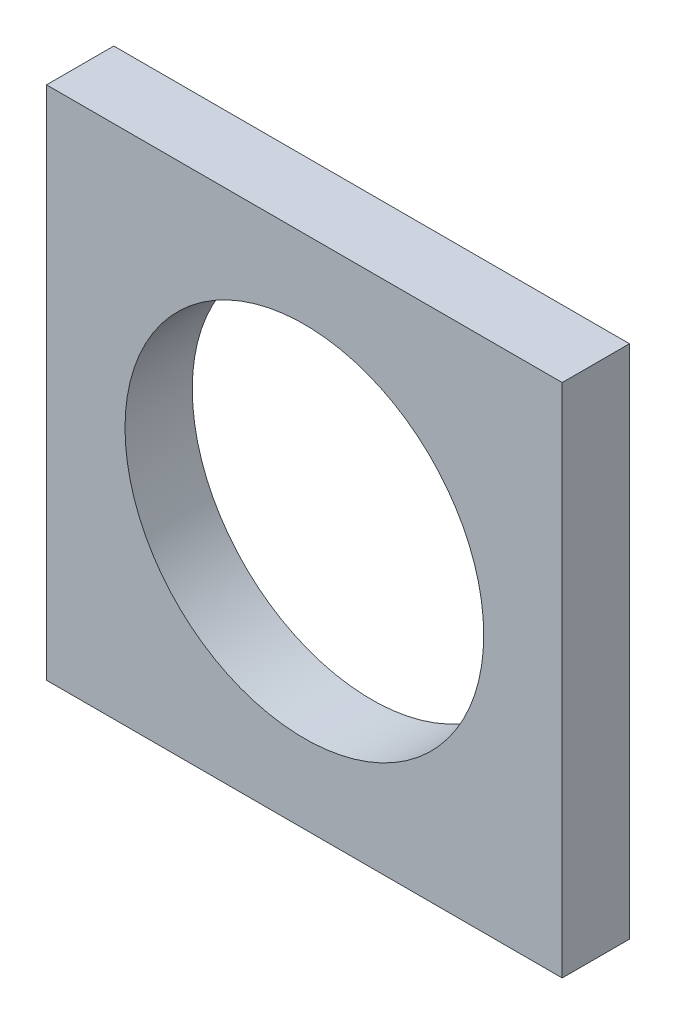
ISO-10303-21;
HEADER;
FILE_DESCRIPTION(('STEP AP214'),'2;1');
FILE_NAME('part.step','',(''),(''),'','','');
FILE_SCHEMA(('AUTOMOTIVE_DESIGN { 1 0 10303 214 1 1 1 1 }'));
ENDSEC;
DATA;
#1=APPLICATION_CONTEXT('core data for automotive mechanical design processes');
#2=APPLICATION_PROTOCOL_DEFINITION('international standard','automotive_design',2000,#1);
#3=PRODUCT_CONTEXT('',#1,'mechanical');
#4=PRODUCT('Part','Part','',(#3));
#5=PRODUCT_RELATED_PRODUCT_CATEGORY('part','',(#4));
#6=PRODUCT_DEFINITION_FORMATION('','',#4);
#7=PRODUCT_DEFINITION_CONTEXT('part definition',#1,'design');
#8=PRODUCT_DEFINITION('design','',#6,#7);
#9=PRODUCT_DEFINITION_SHAPE('','',#8);
#10=(LENGTH_UNIT() NAMED_UNIT(*) SI_UNIT(.MILLI.,.METRE.));
#11=(NAMED_UNIT(*) PLANE_ANGLE_UNIT() SI_UNIT($,.RADIAN.));
#12=(NAMED_UNIT(*) SI_UNIT($,.STERADIAN.) SOLID_ANGLE_UNIT());
#13=UNCERTAINTY_MEASURE_WITH_UNIT(LENGTH_MEASURE(1.E-05),#10,'distance_accuracy_value','');
#14=(GEOMETRIC_REPRESENTATION_CONTEXT(3) GLOBAL_UNCERTAINTY_ASSIGNED_CONTEXT((#13)) GLOBAL_UNIT_ASSIGNED_CONTEXT((#10,
#11,#12)) REPRESENTATION_CONTEXT('',''));
#15=CARTESIAN_POINT('',(0.,0.,0.));
#16=DIRECTION('',(0.,0.,1.));
#17=DIRECTION('',(1.,0.,0.));
#18=AXIS2_PLACEMENT_3D('',#15,#16,#17);
#19=CARTESIAN_POINT('',(0.,0.,3.));
#20=DIRECTION('',(0.,0.,1.));
#21=DIRECTION('',(1.,0.,0.));
#22=AXIS2_PLACEMENT_3D('',#19,#20,#21);
#23=PLANE('',#22);
#24=DIRECTION('',(0.,-1.,0.));
#25=VECTOR('',#24,1.);
#26=CARTESIAN_POINT('',(-11.5,-11.5,3.));
#27=LINE('',#26,#25);
#28=CARTESIAN_POINT('',(-11.5,11.5,3.));
#29=VERTEX_POINT('',#28);
#30=CARTESIAN_POINT('',(-11.5,-11.5,3.));
#31=VERTEX_POINT('',#30);
#32=EDGE_CURVE('E92',#29,#31,#27,.T.);
#33=ORIENTED_EDGE('',*,*,#32,.T.);
#34=DIRECTION('',(1.,0.,0.));
#35=VECTOR('',#34,1.);
#36=CARTESIAN_POINT('',(11.5,-11.5,3.));
#37=LINE('',#36,#35);
#38=CARTESIAN_POINT('',(11.5,-11.5,3.));
#39=VERTEX_POINT('',#38);
#40=EDGE_CURVE('E87',#31,#39,#37,.T.);
#41=ORIENTED_EDGE('',*,*,#40,.T.);
#42=DIRECTION('',(0.,1.,0.));
#43=VECTOR('',#42,1.);
#44=CARTESIAN_POINT('',(11.5,-11.5,3.));
#45=LINE('',#44,#43);
#46=CARTESIAN_POINT('',(11.5,11.5,3.));
#47=VERTEX_POINT('',#46);
#48=EDGE_CURVE('E90',#39,#47,#45,.T.);
#49=ORIENTED_EDGE('',*,*,#48,.T.);
#50=DIRECTION('',(-1.,0.,0.));
#51=VECTOR('',#50,1.);
#52=CARTESIAN_POINT('',(11.5,11.5,3.));
#53=LINE('',#52,#51);
#54=EDGE_CURVE('E57',#47,#29,#53,.T.);
#55=ORIENTED_EDGE('',*,*,#54,.T.);
#56=EDGE_LOOP('',(#33,#41,#49,#55));
#57=FACE_BOUND('',#56,.T.);
#58=CARTESIAN_POINT('',(0.,0.,3.));
#59=DIRECTION('',(0.,0.,1.));
#60=DIRECTION('',(1.,0.,0.));
#61=AXIS2_PLACEMENT_3D('',#58,#59,#60);
#62=CIRCLE('',#61,8.);
#63=CARTESIAN_POINT('',(8.00000000000001,0.,3.));
#64=VERTEX_POINT('',#63);
#65=EDGE_CURVE('E112',#64,#64,#62,.T.);
#66=ORIENTED_EDGE('',*,*,#65,.F.);
#67=EDGE_LOOP('',(#66));
#68=FACE_BOUND('',#67,.T.);
#69=ADVANCED_FACE('F39',(#57,#68),#23,.T.);
#70=CARTESIAN_POINT('',(0.,0.,0.));
#71=DIRECTION('',(0.,0.,1.));
#72=DIRECTION('',(1.,0.,0.));
#73=AXIS2_PLACEMENT_3D('',#70,#71,#72);
#74=PLANE('',#73);
#75=DIRECTION('',(0.,-1.,0.));
#76=VECTOR('',#75,1.);
#77=CARTESIAN_POINT('',(-11.5,-11.5,0.));
#78=LINE('',#77,#76);
#79=CARTESIAN_POINT('',(-11.5,11.5,0.));
#80=VERTEX_POINT('',#79);
#81=CARTESIAN_POINT('',(-11.5,-11.5,0.));
#82=VERTEX_POINT('',#81);
#83=EDGE_CURVE('E108',#80,#82,#78,.T.);
#84=ORIENTED_EDGE('',*,*,#83,.F.);
#85=DIRECTION('',(-1.,0.,0.));
#86=VECTOR('',#85,1.);
#87=CARTESIAN_POINT('',(11.5,11.5,0.));
#88=LINE('',#87,#86);
#89=CARTESIAN_POINT('',(11.5,11.5,0.));
#90=VERTEX_POINT('',#89);
#91=EDGE_CURVE('E80',#90,#80,#88,.T.);
#92=ORIENTED_EDGE('',*,*,#91,.F.);
#93=DIRECTION('',(0.,1.,0.));
#94=VECTOR('',#93,1.);
#95=CARTESIAN_POINT('',(11.5,-11.5,0.));
#96=LINE('',#95,#94);
#97=CARTESIAN_POINT('',(11.5,-11.5,0.));
#98=VERTEX_POINT('',#97);
#99=EDGE_CURVE('E74',#98,#90,#96,.T.);
#100=ORIENTED_EDGE('',*,*,#99,.F.);
#101=DIRECTION('',(1.,0.,0.));
#102=VECTOR('',#101,1.);
#103=CARTESIAN_POINT('',(11.5,-11.5,0.));
#104=LINE('',#103,#102);
#105=EDGE_CURVE('E97',#82,#98,#104,.T.);
#106=ORIENTED_EDGE('',*,*,#105,.F.);
#107=EDGE_LOOP('',(#84,#92,#100,#106));
#108=FACE_BOUND('',#107,.T.);
#109=CARTESIAN_POINT('',(0.,0.,0.));
#110=DIRECTION('',(0.,0.,1.));
#111=DIRECTION('',(1.,0.,0.));
#112=AXIS2_PLACEMENT_3D('',#109,#110,#111);
#113=CIRCLE('',#112,8.);
#114=CARTESIAN_POINT('',(8.00000000000001,0.,0.));
#115=VERTEX_POINT('',#114);
#116=EDGE_CURVE('E130',#115,#115,#113,.T.);
#117=ORIENTED_EDGE('',*,*,#116,.T.);
#118=EDGE_LOOP('',(#117));
#119=FACE_BOUND('',#118,.T.);
#120=ADVANCED_FACE('F125',(#108,#119),#74,.F.);
#121=CARTESIAN_POINT('',(-11.5,-11.5,3.));
#122=DIRECTION('',(1.,0.,0.));
#123=DIRECTION('',(0.,0.,-1.));
#124=AXIS2_PLACEMENT_3D('',#121,#122,#123);
#125=PLANE('',#124);
#126=ORIENTED_EDGE('',*,*,#83,.T.);
#127=DIRECTION('',(0.,0.,-1.));
#128=VECTOR('',#127,1.);
#129=CARTESIAN_POINT('',(-11.5,-11.5,3.));
#130=LINE('',#129,#128);
#131=EDGE_CURVE('E11',#31,#82,#130,.T.);
#132=ORIENTED_EDGE('',*,*,#131,.F.);
#133=ORIENTED_EDGE('',*,*,#32,.F.);
#134=DIRECTION('',(0.,0.,-1.));
#135=VECTOR('',#134,1.);
#136=CARTESIAN_POINT('',(-11.5,11.5,3.));
#137=LINE('',#136,#135);
#138=EDGE_CURVE('E104',#29,#80,#137,.T.);
#139=ORIENTED_EDGE('',*,*,#138,.T.);
#140=EDGE_LOOP('',(#126,#132,#133,#139));
#141=FACE_BOUND('',#140,.T.);
#142=ADVANCED_FACE('F41',(#141),#125,.F.);
#143=CARTESIAN_POINT('',(11.5,-11.5,3.));
#144=DIRECTION('',(0.,1.,0.));
#145=DIRECTION('',(-1.,0.,0.));
#146=AXIS2_PLACEMENT_3D('',#143,#144,#145);
#147=PLANE('',#146);
#148=ORIENTED_EDGE('',*,*,#105,.T.);
#149=DIRECTION('',(0.,0.,-1.));
#150=VECTOR('',#149,1.);
#151=CARTESIAN_POINT('',(11.5,-11.5,3.));
#152=LINE('',#151,#150);
#153=EDGE_CURVE('E49',#39,#98,#152,.T.);
#154=ORIENTED_EDGE('',*,*,#153,.F.);
#155=ORIENTED_EDGE('',*,*,#40,.F.);
#156=ORIENTED_EDGE('',*,*,#131,.T.);
#157=EDGE_LOOP('',(#148,#154,#155,#156));
#158=FACE_BOUND('',#157,.T.);
#159=ADVANCED_FACE('F96',(#158),#147,.F.);
#160=CARTESIAN_POINT('',(11.5,-11.5,3.));
#161=DIRECTION('',(-1.,0.,0.));
#162=DIRECTION('',(0.,0.,1.));
#163=AXIS2_PLACEMENT_3D('',#160,#161,#162);
#164=PLANE('',#163);
#165=ORIENTED_EDGE('',*,*,#99,.T.);
#166=DIRECTION('',(0.,0.,-1.));
#167=VECTOR('',#166,1.);
#168=CARTESIAN_POINT('',(11.5,11.5,3.));
#169=LINE('',#168,#167);
#170=EDGE_CURVE('E99',#47,#90,#169,.T.);
#171=ORIENTED_EDGE('',*,*,#170,.F.);
#172=ORIENTED_EDGE('',*,*,#48,.F.);
#173=ORIENTED_EDGE('',*,*,#153,.T.);
#174=EDGE_LOOP('',(#165,#171,#172,#173));
#175=FACE_BOUND('',#174,.T.);
#176=ADVANCED_FACE('F100',(#175),#164,.F.);
#177=CARTESIAN_POINT('',(11.5,11.5,3.));
#178=DIRECTION('',(0.,-1.,0.));
#179=DIRECTION('',(1.,0.,0.));
#180=AXIS2_PLACEMENT_3D('',#177,#178,#179);
#181=PLANE('',#180);
#182=ORIENTED_EDGE('',*,*,#91,.T.);
#183=ORIENTED_EDGE('',*,*,#138,.F.);
#184=ORIENTED_EDGE('',*,*,#54,.F.);
#185=ORIENTED_EDGE('',*,*,#170,.T.);
#186=EDGE_LOOP('',(#182,#183,#184,#185));
#187=FACE_BOUND('',#186,.T.);
#188=ADVANCED_FACE('F122',(#187),#181,.F.);
#189=CARTESIAN_POINT('',(0.,0.,3.));
#190=DIRECTION('',(0.,0.,-1.));
#191=DIRECTION('',(-1.,0.,0.));
#192=AXIS2_PLACEMENT_3D('',#189,#190,#191);
#193=CYLINDRICAL_SURFACE('',#192,8.);
#194=ORIENTED_EDGE('',*,*,#65,.T.);
#195=EDGE_LOOP('',(#194));
#196=FACE_BOUND('',#195,.T.);
#197=ORIENTED_EDGE('',*,*,#116,.F.);
#198=EDGE_LOOP('',(#197));
#199=FACE_BOUND('',#198,.T.);
#200=ADVANCED_FACE('F138',(#196,#199),#193,.F.);
#201=CLOSED_SHELL('',(#69,#120,#142,#159,#176,#188,#200));
#202=MANIFOLD_SOLID_BREP('B2',#201);
#203=ADVANCED_BREP_SHAPE_REPRESENTATION('',(#18,#202),#14);
#204=SHAPE_DEFINITION_REPRESENTATION(#9,#203);
ENDSEC;
END-ISO-10303-21;
